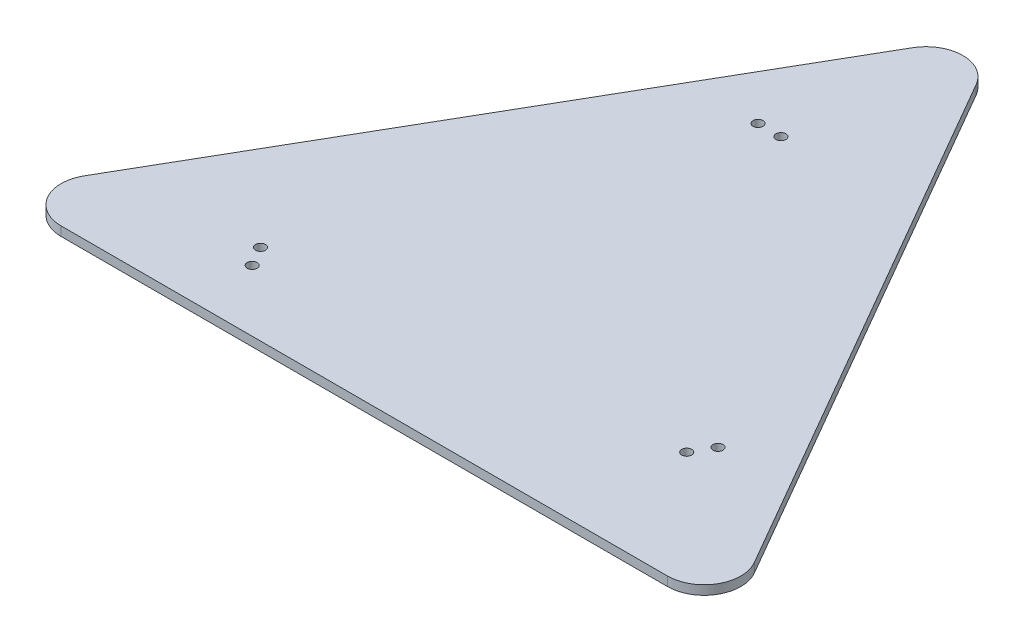
ISO-10303-21;
HEADER;
FILE_DESCRIPTION(('STEP AP214'),'2;1');
FILE_NAME('part.step','',(''),(''),'','','');
FILE_SCHEMA(('AUTOMOTIVE_DESIGN { 1 0 10303 214 1 1 1 1 }'));
ENDSEC;
DATA;
#1=APPLICATION_CONTEXT('core data for automotive mechanical design processes');
#2=APPLICATION_PROTOCOL_DEFINITION('international standard','automotive_design',2000,#1);
#3=PRODUCT_CONTEXT('',#1,'mechanical');
#4=PRODUCT('Part','Part','',(#3));
#5=PRODUCT_RELATED_PRODUCT_CATEGORY('part','',(#4));
#6=PRODUCT_DEFINITION_FORMATION('','',#4);
#7=PRODUCT_DEFINITION_CONTEXT('part definition',#1,'design');
#8=PRODUCT_DEFINITION('design','',#6,#7);
#9=PRODUCT_DEFINITION_SHAPE('','',#8);
#10=(LENGTH_UNIT() NAMED_UNIT(*) SI_UNIT(.MILLI.,.METRE.));
#11=(NAMED_UNIT(*) PLANE_ANGLE_UNIT() SI_UNIT($,.RADIAN.));
#12=(NAMED_UNIT(*) SI_UNIT($,.STERADIAN.) SOLID_ANGLE_UNIT());
#13=UNCERTAINTY_MEASURE_WITH_UNIT(LENGTH_MEASURE(1.E-05),#10,'distance_accuracy_value','');
#14=(GEOMETRIC_REPRESENTATION_CONTEXT(3) GLOBAL_UNCERTAINTY_ASSIGNED_CONTEXT((#13)) GLOBAL_UNIT_ASSIGNED_CONTEXT((#10,
#11,#12)) REPRESENTATION_CONTEXT('',''));
#15=CARTESIAN_POINT('',(0.,0.,0.));
#16=DIRECTION('',(0.,0.,1.));
#17=DIRECTION('',(1.,0.,0.));
#18=AXIS2_PLACEMENT_3D('',#15,#16,#17);
#19=CARTESIAN_POINT('',(127.,3.175,73.3234841870812));
#20=DIRECTION('',(-0.866025403784437,0.,0.500000000000002));
#21=DIRECTION('',(0.500000000000002,0.,0.866025403784437));
#22=AXIS2_PLACEMENT_3D('',#19,#20,#21);
#23=PLANE('',#22);
#24=DIRECTION('',(-0.500000000000002,0.,-0.866025403784437));
#25=VECTOR('',#24,1.);
#26=CARTESIAN_POINT('',(127.,3.175,73.3234841870812));
#27=LINE('',#26,#25);
#28=CARTESIAN_POINT('',(116.001477371938,3.175,54.2734841870813));
#29=VERTEX_POINT('',#28);
#30=CARTESIAN_POINT('',(10.9985226280624,3.175,-127.596968374165));
#31=VERTEX_POINT('',#30);
#32=EDGE_CURVE('E105',#29,#31,#27,.T.);
#33=ORIENTED_EDGE('',*,*,#32,.F.);
#34=DIRECTION('',(0.,-1.,0.));
#35=VECTOR('',#34,1.);
#36=CARTESIAN_POINT('',(116.001477371938,3.175,54.2734841870813));
#37=LINE('',#36,#35);
#38=CARTESIAN_POINT('',(116.001477371938,0.,54.2734841870813));
#39=VERTEX_POINT('',#38);
#40=EDGE_CURVE('E91',#29,#39,#37,.T.);
#41=ORIENTED_EDGE('',*,*,#40,.T.);
#42=DIRECTION('',(-0.500000000000002,0.,-0.866025403784437));
#43=VECTOR('',#42,1.);
#44=CARTESIAN_POINT('',(127.,0.,73.3234841870812));
#45=LINE('',#44,#43);
#46=CARTESIAN_POINT('',(10.9985226280624,0.,-127.596968374165));
#47=VERTEX_POINT('',#46);
#48=EDGE_CURVE('E103',#39,#47,#45,.T.);
#49=ORIENTED_EDGE('',*,*,#48,.T.);
#50=DIRECTION('',(0.,-1.,0.));
#51=VECTOR('',#50,1.);
#52=CARTESIAN_POINT('',(10.9985226280624,3.175,-127.596968374165));
#53=LINE('',#52,#51);
#54=EDGE_CURVE('E107',#47,#31,#53,.F.);
#55=ORIENTED_EDGE('',*,*,#54,.T.);
#56=EDGE_LOOP('',(#33,#41,#49,#55));
#57=FACE_BOUND('',#56,.T.);
#58=ADVANCED_FACE('F34',(#57),#23,.F.);
#59=CARTESIAN_POINT('',(0.,3.175,-146.646968374165));
#60=DIRECTION('',(0.86602540378444,0.,0.499999999999998));
#61=DIRECTION('',(0.499999999999998,0.,-0.86602540378444));
#62=AXIS2_PLACEMENT_3D('',#59,#60,#61);
#63=PLANE('',#62);
#64=DIRECTION('',(-0.499999999999998,0.,0.86602540378444));
#65=VECTOR('',#64,1.);
#66=CARTESIAN_POINT('',(0.,0.,-146.646968374165));
#67=LINE('',#66,#65);
#68=CARTESIAN_POINT('',(-10.9985226280623,0.,-127.596968374165));
#69=VERTEX_POINT('',#68);
#70=CARTESIAN_POINT('',(-116.001477371937,0.,54.2734841870828));
#71=VERTEX_POINT('',#70);
#72=EDGE_CURVE('E111',#69,#71,#67,.T.);
#73=ORIENTED_EDGE('',*,*,#72,.T.);
#74=DIRECTION('',(0.,-1.,0.));
#75=VECTOR('',#74,1.);
#76=CARTESIAN_POINT('',(-116.001477371937,3.175,54.2734841870829));
#77=LINE('',#76,#75);
#78=CARTESIAN_POINT('',(-116.001477371937,3.175,54.2734841870828));
#79=VERTEX_POINT('',#78);
#80=EDGE_CURVE('E11',#71,#79,#77,.F.);
#81=ORIENTED_EDGE('',*,*,#80,.T.);
#82=DIRECTION('',(-0.499999999999998,0.,0.86602540378444));
#83=VECTOR('',#82,1.);
#84=CARTESIAN_POINT('',(0.,3.175,-146.646968374165));
#85=LINE('',#84,#83);
#86=CARTESIAN_POINT('',(-10.9985226280623,3.175,-127.596968374165));
#87=VERTEX_POINT('',#86);
#88=EDGE_CURVE('E137',#87,#79,#85,.T.);
#89=ORIENTED_EDGE('',*,*,#88,.F.);
#90=DIRECTION('',(0.,-1.,0.));
#91=VECTOR('',#90,1.);
#92=CARTESIAN_POINT('',(-10.9985226280623,3.175,-127.596968374165));
#93=LINE('',#92,#91);
#94=EDGE_CURVE('E42',#87,#69,#93,.T.);
#95=ORIENTED_EDGE('',*,*,#94,.T.);
#96=EDGE_LOOP('',(#73,#81,#89,#95));
#97=FACE_BOUND('',#96,.T.);
#98=ADVANCED_FACE('F136',(#97),#63,.F.);
#99=CARTESIAN_POINT('',(-126.999999999999,3.175,73.323484187083));
#100=DIRECTION('',(0.,0.,-1.));
#101=DIRECTION('',(-1.,0.,0.));
#102=AXIS2_PLACEMENT_3D('',#99,#100,#101);
#103=PLANE('',#102);
#104=DIRECTION('',(1.,0.,0.));
#105=VECTOR('',#104,1.);
#106=CARTESIAN_POINT('',(-126.999999999999,0.,73.323484187083));
#107=LINE('',#106,#105);
#108=CARTESIAN_POINT('',(-105.002954743875,0.,73.3234841870828));
#109=VERTEX_POINT('',#108);
#110=CARTESIAN_POINT('',(105.002954743875,0.,73.3234841870813));
#111=VERTEX_POINT('',#110);
#112=EDGE_CURVE('E114',#109,#111,#107,.T.);
#113=ORIENTED_EDGE('',*,*,#112,.T.);
#114=DIRECTION('',(0.,-1.,0.));
#115=VECTOR('',#114,1.);
#116=CARTESIAN_POINT('',(105.002954743875,3.175,73.3234841870813));
#117=LINE('',#116,#115);
#118=CARTESIAN_POINT('',(105.002954743875,3.175,73.3234841870813));
#119=VERTEX_POINT('',#118);
#120=EDGE_CURVE('E92',#111,#119,#117,.F.);
#121=ORIENTED_EDGE('',*,*,#120,.T.);
#122=DIRECTION('',(1.,0.,0.));
#123=VECTOR('',#122,1.);
#124=CARTESIAN_POINT('',(-126.999999999999,3.175,73.323484187083));
#125=LINE('',#124,#123);
#126=CARTESIAN_POINT('',(-105.002954743875,3.175,73.3234841870828));
#127=VERTEX_POINT('',#126);
#128=EDGE_CURVE('E120',#127,#119,#125,.T.);
#129=ORIENTED_EDGE('',*,*,#128,.F.);
#130=DIRECTION('',(0.,-1.,0.));
#131=VECTOR('',#130,1.);
#132=CARTESIAN_POINT('',(-105.002954743875,3.175,73.3234841870828));
#133=LINE('',#132,#131);
#134=EDGE_CURVE('E97',#127,#109,#133,.T.);
#135=ORIENTED_EDGE('',*,*,#134,.T.);
#136=EDGE_LOOP('',(#113,#121,#129,#135));
#137=FACE_BOUND('',#136,.T.);
#138=ADVANCED_FACE('F145',(#137),#103,.F.);
#139=CARTESIAN_POINT('',(0.,3.175,0.));
#140=DIRECTION('',(0.,1.,0.));
#141=DIRECTION('',(0.,0.,1.));
#142=AXIS2_PLACEMENT_3D('',#139,#140,#141);
#143=PLANE('',#142);
#144=CARTESIAN_POINT('',(75.1555459855272,3.175,25.9987442566607));
#145=DIRECTION('',(0.,1.,0.));
#146=DIRECTION('',(0.,0.,1.));
#147=AXIS2_PLACEMENT_3D('',#144,#145,#146);
#148=CIRCLE('',#147,1.72720000000002);
#149=CARTESIAN_POINT('',(75.1555459855272,3.175,27.7259442566607));
#150=VERTEX_POINT('',#149);
#151=EDGE_CURVE('E173',#150,#150,#148,.T.);
#152=ORIENTED_EDGE('',*,*,#151,.F.);
#153=EDGE_LOOP('',(#152));
#154=FACE_BOUND('',#153,.T.);
#155=CARTESIAN_POINT('',(-7.13740000000208,3.175,-78.0859841870827));
#156=DIRECTION('',(0.,1.,0.));
#157=DIRECTION('',(0.,0.,1.));
#158=AXIS2_PLACEMENT_3D('',#155,#156,#157);
#159=CIRCLE('',#158,1.7272);
#160=CARTESIAN_POINT('',(-7.13740000000208,3.175,-76.3587841870827));
#161=VERTEX_POINT('',#160);
#162=EDGE_CURVE('E167',#161,#161,#159,.T.);
#163=ORIENTED_EDGE('',*,*,#162,.F.);
#164=EDGE_LOOP('',(#163));
#165=FACE_BOUND('',#164,.T.);
#166=CARTESIAN_POINT('',(-15.0622000000021,3.175,-78.0859841870827));
#167=DIRECTION('',(0.,1.,0.));
#168=DIRECTION('',(0.,0.,1.));
#169=AXIS2_PLACEMENT_3D('',#166,#167,#168);
#170=CIRCLE('',#169,1.7272);
#171=CARTESIAN_POINT('',(-15.0622000000021,3.175,-76.3587841870827));
#172=VERTEX_POINT('',#171);
#173=EDGE_CURVE('E161',#172,#172,#170,.T.);
#174=ORIENTED_EDGE('',*,*,#173,.F.);
#175=EDGE_LOOP('',(#174));
#176=FACE_BOUND('',#175,.T.);
#177=CARTESIAN_POINT('',(71.1931459855272,3.175,32.8618223765716));
#178=DIRECTION('',(0.,1.,0.));
#179=DIRECTION('',(0.,0.,1.));
#180=AXIS2_PLACEMENT_3D('',#177,#178,#179);
#181=CIRCLE('',#180,1.72720000000002);
#182=CARTESIAN_POINT('',(71.1931459855272,3.175,34.5890223765716));
#183=VERTEX_POINT('',#182);
#184=EDGE_CURVE('E155',#183,#183,#181,.T.);
#185=ORIENTED_EDGE('',*,*,#184,.F.);
#186=EDGE_LOOP('',(#185));
#187=FACE_BOUND('',#186,.T.);
#188=CARTESIAN_POINT('',(-60.0933459855231,3.175,52.0872399304228));
#189=DIRECTION('',(0.,1.,0.));
#190=DIRECTION('',(0.,0.,1.));
#191=AXIS2_PLACEMENT_3D('',#188,#189,#190);
#192=CIRCLE('',#191,1.72720000000002);
#193=CARTESIAN_POINT('',(-60.0933459855231,3.175,53.8144399304228));
#194=VERTEX_POINT('',#193);
#195=EDGE_CURVE('E150',#194,#194,#192,.T.);
#196=ORIENTED_EDGE('',*,*,#195,.F.);
#197=EDGE_LOOP('',(#196));
#198=FACE_BOUND('',#197,.T.);
#199=CARTESIAN_POINT('',(-64.0557459855232,3.175,45.2241618105119));
#200=DIRECTION('',(0.,1.,0.));
#201=DIRECTION('',(0.,0.,1.));
#202=AXIS2_PLACEMENT_3D('',#199,#200,#201);
#203=CIRCLE('',#202,1.72720000000001);
#204=CARTESIAN_POINT('',(-64.0557459855232,3.175,46.9513618105119));
#205=VERTEX_POINT('',#204);
#206=EDGE_CURVE('E117',#205,#205,#203,.T.);
#207=ORIENTED_EDGE('',*,*,#206,.F.);
#208=EDGE_LOOP('',(#207));
#209=FACE_BOUND('',#208,.T.);
#210=ORIENTED_EDGE('',*,*,#128,.T.);
#211=CARTESIAN_POINT('',(105.002954743875,3.175,60.6234841870813));
#212=DIRECTION('',(0.,1.,0.));
#213=DIRECTION('',(0.,0.,1.));
#214=AXIS2_PLACEMENT_3D('',#211,#212,#213);
#215=CIRCLE('',#214,12.7);
#216=EDGE_CURVE('E133',#119,#29,#215,.T.);
#217=ORIENTED_EDGE('',*,*,#216,.T.);
#218=ORIENTED_EDGE('',*,*,#32,.T.);
#219=CARTESIAN_POINT('',(0.,3.175,-121.246968374165));
#220=DIRECTION('',(0.,1.,0.));
#221=DIRECTION('',(0.,0.,1.));
#222=AXIS2_PLACEMENT_3D('',#219,#220,#221);
#223=CIRCLE('',#222,12.7);
#224=EDGE_CURVE('E54',#31,#87,#223,.T.);
#225=ORIENTED_EDGE('',*,*,#224,.T.);
#226=ORIENTED_EDGE('',*,*,#88,.T.);
#227=CARTESIAN_POINT('',(-105.002954743875,3.175,60.6234841870828));
#228=DIRECTION('',(0.,1.,0.));
#229=DIRECTION('',(0.,0.,1.));
#230=AXIS2_PLACEMENT_3D('',#227,#228,#229);
#231=CIRCLE('',#230,12.7);
#232=EDGE_CURVE('E131',#79,#127,#231,.T.);
#233=ORIENTED_EDGE('',*,*,#232,.T.);
#234=EDGE_LOOP('',(#210,#217,#218,#225,#226,#233));
#235=FACE_BOUND('',#234,.T.);
#236=ADVANCED_FACE('F184',(#154,#165,#176,#187,#198,#209,#235),#143,.T.);
#237=CARTESIAN_POINT('',(0.,0.,0.));
#238=DIRECTION('',(0.,1.,0.));
#239=DIRECTION('',(0.,0.,1.));
#240=AXIS2_PLACEMENT_3D('',#237,#238,#239);
#241=PLANE('',#240);
#242=CARTESIAN_POINT('',(75.1555459855272,0.,25.9987442566607));
#243=DIRECTION('',(0.,1.,0.));
#244=DIRECTION('',(0.,0.,1.));
#245=AXIS2_PLACEMENT_3D('',#242,#243,#244);
#246=CIRCLE('',#245,1.72720000000002);
#247=CARTESIAN_POINT('',(75.1555459855272,0.,27.7259442566607));
#248=VERTEX_POINT('',#247);
#249=EDGE_CURVE('E176',#248,#248,#246,.T.);
#250=ORIENTED_EDGE('',*,*,#249,.T.);
#251=EDGE_LOOP('',(#250));
#252=FACE_BOUND('',#251,.T.);
#253=CARTESIAN_POINT('',(-7.13740000000208,0.,-78.0859841870827));
#254=DIRECTION('',(0.,1.,0.));
#255=DIRECTION('',(0.,0.,1.));
#256=AXIS2_PLACEMENT_3D('',#253,#254,#255);
#257=CIRCLE('',#256,1.7272);
#258=CARTESIAN_POINT('',(-7.13740000000208,0.,-76.3587841870827));
#259=VERTEX_POINT('',#258);
#260=EDGE_CURVE('E170',#259,#259,#257,.T.);
#261=ORIENTED_EDGE('',*,*,#260,.T.);
#262=EDGE_LOOP('',(#261));
#263=FACE_BOUND('',#262,.T.);
#264=CARTESIAN_POINT('',(-15.0622000000021,0.,-78.0859841870827));
#265=DIRECTION('',(0.,1.,0.));
#266=DIRECTION('',(0.,0.,1.));
#267=AXIS2_PLACEMENT_3D('',#264,#265,#266);
#268=CIRCLE('',#267,1.7272);
#269=CARTESIAN_POINT('',(-15.0622000000021,0.,-76.3587841870827));
#270=VERTEX_POINT('',#269);
#271=EDGE_CURVE('E164',#270,#270,#268,.T.);
#272=ORIENTED_EDGE('',*,*,#271,.T.);
#273=EDGE_LOOP('',(#272));
#274=FACE_BOUND('',#273,.T.);
#275=CARTESIAN_POINT('',(71.1931459855272,0.,32.8618223765716));
#276=DIRECTION('',(0.,1.,0.));
#277=DIRECTION('',(0.,0.,1.));
#278=AXIS2_PLACEMENT_3D('',#275,#276,#277);
#279=CIRCLE('',#278,1.72720000000002);
#280=CARTESIAN_POINT('',(71.1931459855272,0.,34.5890223765716));
#281=VERTEX_POINT('',#280);
#282=EDGE_CURVE('E158',#281,#281,#279,.T.);
#283=ORIENTED_EDGE('',*,*,#282,.T.);
#284=EDGE_LOOP('',(#283));
#285=FACE_BOUND('',#284,.T.);
#286=CARTESIAN_POINT('',(-60.0933459855231,0.,52.0872399304228));
#287=DIRECTION('',(0.,1.,0.));
#288=DIRECTION('',(0.,0.,1.));
#289=AXIS2_PLACEMENT_3D('',#286,#287,#288);
#290=CIRCLE('',#289,1.72720000000002);
#291=CARTESIAN_POINT('',(-60.0933459855231,0.,53.8144399304228));
#292=VERTEX_POINT('',#291);
#293=EDGE_CURVE('E152',#292,#292,#290,.T.);
#294=ORIENTED_EDGE('',*,*,#293,.T.);
#295=EDGE_LOOP('',(#294));
#296=FACE_BOUND('',#295,.T.);
#297=CARTESIAN_POINT('',(-64.0557459855232,0.,45.2241618105119));
#298=DIRECTION('',(0.,1.,0.));
#299=DIRECTION('',(0.,0.,1.));
#300=AXIS2_PLACEMENT_3D('',#297,#298,#299);
#301=CIRCLE('',#300,1.72720000000001);
#302=CARTESIAN_POINT('',(-64.0557459855232,0.,46.9513618105119));
#303=VERTEX_POINT('',#302);
#304=EDGE_CURVE('E112',#303,#303,#301,.T.);
#305=ORIENTED_EDGE('',*,*,#304,.T.);
#306=EDGE_LOOP('',(#305));
#307=FACE_BOUND('',#306,.T.);
#308=ORIENTED_EDGE('',*,*,#48,.F.);
#309=CARTESIAN_POINT('',(105.002954743875,0.,60.6234841870813));
#310=DIRECTION('',(0.,1.,0.));
#311=DIRECTION('',(0.,0.,1.));
#312=AXIS2_PLACEMENT_3D('',#309,#310,#311);
#313=CIRCLE('',#312,12.7);
#314=EDGE_CURVE('E87',#39,#111,#313,.F.);
#315=ORIENTED_EDGE('',*,*,#314,.T.);
#316=ORIENTED_EDGE('',*,*,#112,.F.);
#317=CARTESIAN_POINT('',(-105.002954743875,0.,60.6234841870828));
#318=DIRECTION('',(0.,1.,0.));
#319=DIRECTION('',(0.,0.,1.));
#320=AXIS2_PLACEMENT_3D('',#317,#318,#319);
#321=CIRCLE('',#320,12.7);
#322=EDGE_CURVE('E98',#109,#71,#321,.F.);
#323=ORIENTED_EDGE('',*,*,#322,.T.);
#324=ORIENTED_EDGE('',*,*,#72,.F.);
#325=CARTESIAN_POINT('',(0.,0.,-121.246968374165));
#326=DIRECTION('',(0.,1.,0.));
#327=DIRECTION('',(0.,0.,1.));
#328=AXIS2_PLACEMENT_3D('',#325,#326,#327);
#329=CIRCLE('',#328,12.7);
#330=EDGE_CURVE('E106',#69,#47,#329,.F.);
#331=ORIENTED_EDGE('',*,*,#330,.T.);
#332=EDGE_LOOP('',(#308,#315,#316,#323,#324,#331));
#333=FACE_BOUND('',#332,.T.);
#334=ADVANCED_FACE('F109',(#252,#263,#274,#285,#296,#307,#333),#241,.F.);
#335=CARTESIAN_POINT('',(-64.0557459855232,0.,45.2241618105119));
#336=DIRECTION('',(0.,1.,0.));
#337=DIRECTION('',(0.,0.,1.));
#338=AXIS2_PLACEMENT_3D('',#335,#336,#337);
#339=CYLINDRICAL_SURFACE('',#338,1.72720000000001);
#340=ORIENTED_EDGE('',*,*,#304,.F.);
#341=EDGE_LOOP('',(#340));
#342=FACE_BOUND('',#341,.T.);
#343=ORIENTED_EDGE('',*,*,#206,.T.);
#344=EDGE_LOOP('',(#343));
#345=FACE_BOUND('',#344,.T.);
#346=ADVANCED_FACE('F198',(#342,#345),#339,.F.);
#347=CARTESIAN_POINT('',(-60.0933459855231,0.,52.0872399304228));
#348=DIRECTION('',(0.,1.,0.));
#349=DIRECTION('',(0.,0.,1.));
#350=AXIS2_PLACEMENT_3D('',#347,#348,#349);
#351=CYLINDRICAL_SURFACE('',#350,1.72720000000002);
#352=ORIENTED_EDGE('',*,*,#293,.F.);
#353=EDGE_LOOP('',(#352));
#354=FACE_BOUND('',#353,.T.);
#355=ORIENTED_EDGE('',*,*,#195,.T.);
#356=EDGE_LOOP('',(#355));
#357=FACE_BOUND('',#356,.T.);
#358=ADVANCED_FACE('F200',(#354,#357),#351,.F.);
#359=CARTESIAN_POINT('',(71.1931459855272,0.,32.8618223765716));
#360=DIRECTION('',(0.,1.,0.));
#361=DIRECTION('',(0.,0.,1.));
#362=AXIS2_PLACEMENT_3D('',#359,#360,#361);
#363=CYLINDRICAL_SURFACE('',#362,1.72720000000002);
#364=ORIENTED_EDGE('',*,*,#282,.F.);
#365=EDGE_LOOP('',(#364));
#366=FACE_BOUND('',#365,.T.);
#367=ORIENTED_EDGE('',*,*,#184,.T.);
#368=EDGE_LOOP('',(#367));
#369=FACE_BOUND('',#368,.T.);
#370=ADVANCED_FACE('F207',(#366,#369),#363,.F.);
#371=CARTESIAN_POINT('',(-15.0622000000021,0.,-78.0859841870827));
#372=DIRECTION('',(0.,1.,0.));
#373=DIRECTION('',(0.,0.,1.));
#374=AXIS2_PLACEMENT_3D('',#371,#372,#373);
#375=CYLINDRICAL_SURFACE('',#374,1.7272);
#376=ORIENTED_EDGE('',*,*,#271,.F.);
#377=EDGE_LOOP('',(#376));
#378=FACE_BOUND('',#377,.T.);
#379=ORIENTED_EDGE('',*,*,#173,.T.);
#380=EDGE_LOOP('',(#379));
#381=FACE_BOUND('',#380,.T.);
#382=ADVANCED_FACE('F288',(#378,#381),#375,.F.);
#383=CARTESIAN_POINT('',(-7.13740000000208,0.,-78.0859841870827));
#384=DIRECTION('',(0.,1.,0.));
#385=DIRECTION('',(0.,0.,1.));
#386=AXIS2_PLACEMENT_3D('',#383,#384,#385);
#387=CYLINDRICAL_SURFACE('',#386,1.7272);
#388=ORIENTED_EDGE('',*,*,#260,.F.);
#389=EDGE_LOOP('',(#388));
#390=FACE_BOUND('',#389,.T.);
#391=ORIENTED_EDGE('',*,*,#162,.T.);
#392=EDGE_LOOP('',(#391));
#393=FACE_BOUND('',#392,.T.);
#394=ADVANCED_FACE('F278',(#390,#393),#387,.F.);
#395=CARTESIAN_POINT('',(75.1555459855272,0.,25.9987442566607));
#396=DIRECTION('',(0.,1.,0.));
#397=DIRECTION('',(0.,0.,1.));
#398=AXIS2_PLACEMENT_3D('',#395,#396,#397);
#399=CYLINDRICAL_SURFACE('',#398,1.72720000000002);
#400=ORIENTED_EDGE('',*,*,#249,.F.);
#401=EDGE_LOOP('',(#400));
#402=FACE_BOUND('',#401,.T.);
#403=ORIENTED_EDGE('',*,*,#151,.T.);
#404=EDGE_LOOP('',(#403));
#405=FACE_BOUND('',#404,.T.);
#406=ADVANCED_FACE('F182',(#402,#405),#399,.F.);
#407=CARTESIAN_POINT('',(105.002954743875,3.175,60.6234841870813));
#408=DIRECTION('',(0.,-1.,0.));
#409=DIRECTION('',(0.,0.,-1.));
#410=AXIS2_PLACEMENT_3D('',#407,#408,#409);
#411=CYLINDRICAL_SURFACE('',#410,12.7);
#412=ORIENTED_EDGE('',*,*,#216,.F.);
#413=ORIENTED_EDGE('',*,*,#120,.F.);
#414=ORIENTED_EDGE('',*,*,#314,.F.);
#415=ORIENTED_EDGE('',*,*,#40,.F.);
#416=EDGE_LOOP('',(#412,#413,#414,#415));
#417=FACE_BOUND('',#416,.T.);
#418=ADVANCED_FACE('F90',(#417),#411,.T.);
#419=CARTESIAN_POINT('',(-105.002954743875,3.175,60.6234841870828));
#420=DIRECTION('',(0.,-1.,0.));
#421=DIRECTION('',(0.,0.,-1.));
#422=AXIS2_PLACEMENT_3D('',#419,#420,#421);
#423=CYLINDRICAL_SURFACE('',#422,12.7);
#424=ORIENTED_EDGE('',*,*,#232,.F.);
#425=ORIENTED_EDGE('',*,*,#80,.F.);
#426=ORIENTED_EDGE('',*,*,#322,.F.);
#427=ORIENTED_EDGE('',*,*,#134,.F.);
#428=EDGE_LOOP('',(#424,#425,#426,#427));
#429=FACE_BOUND('',#428,.T.);
#430=ADVANCED_FACE('F142',(#429),#423,.T.);
#431=CARTESIAN_POINT('',(0.,3.175,-121.246968374165));
#432=DIRECTION('',(0.,-1.,0.));
#433=DIRECTION('',(0.,0.,-1.));
#434=AXIS2_PLACEMENT_3D('',#431,#432,#433);
#435=CYLINDRICAL_SURFACE('',#434,12.7);
#436=ORIENTED_EDGE('',*,*,#224,.F.);
#437=ORIENTED_EDGE('',*,*,#54,.F.);
#438=ORIENTED_EDGE('',*,*,#330,.F.);
#439=ORIENTED_EDGE('',*,*,#94,.F.);
#440=EDGE_LOOP('',(#436,#437,#438,#439));
#441=FACE_BOUND('',#440,.T.);
#442=ADVANCED_FACE('F36',(#441),#435,.T.);
#443=CLOSED_SHELL('',(#58,#98,#138,#236,#334,#346,#358,#370,#382,#394,#406,#418,#430,#442));
#444=MANIFOLD_SOLID_BREP('B2',#443);
#445=ADVANCED_BREP_SHAPE_REPRESENTATION('',(#18,#444),#14);
#446=SHAPE_DEFINITION_REPRESENTATION(#9,#445);
ENDSEC;
END-ISO-10303-21;
